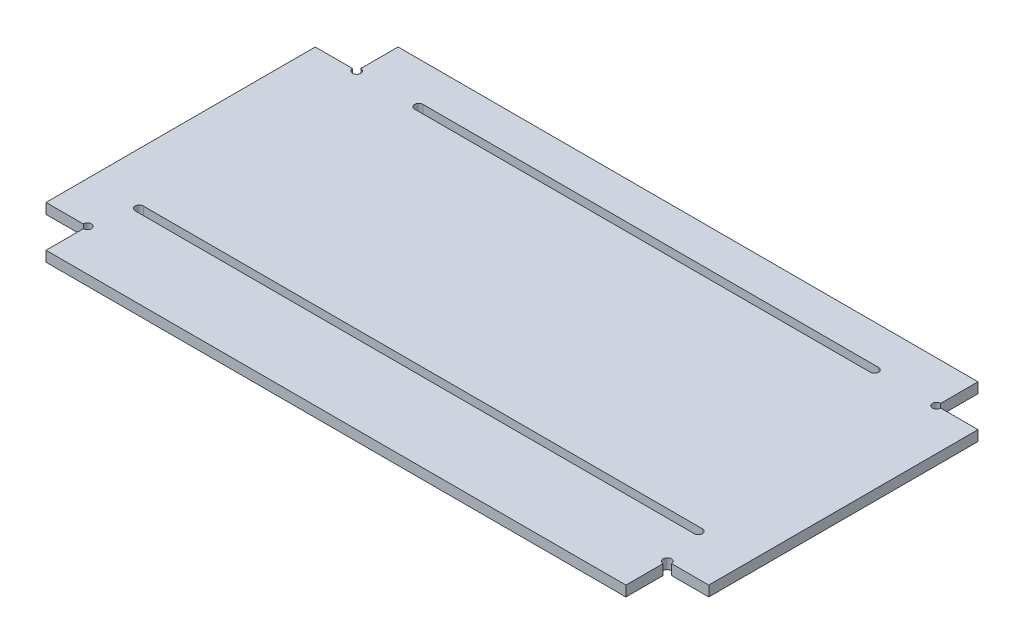
ISO-10303-21;
HEADER;
FILE_DESCRIPTION(('STEP AP214'),'2;1');
FILE_NAME('part.step','',(''),(''),'','','');
FILE_SCHEMA(('AUTOMOTIVE_DESIGN { 1 0 10303 214 1 1 1 1 }'));
ENDSEC;
DATA;
#1=APPLICATION_CONTEXT('core data for automotive mechanical design processes');
#2=APPLICATION_PROTOCOL_DEFINITION('international standard','automotive_design',2000,#1);
#3=PRODUCT_CONTEXT('',#1,'mechanical');
#4=PRODUCT('Part','Part','',(#3));
#5=PRODUCT_RELATED_PRODUCT_CATEGORY('part','',(#4));
#6=PRODUCT_DEFINITION_FORMATION('','',#4);
#7=PRODUCT_DEFINITION_CONTEXT('part definition',#1,'design');
#8=PRODUCT_DEFINITION('design','',#6,#7);
#9=PRODUCT_DEFINITION_SHAPE('','',#8);
#10=(LENGTH_UNIT() NAMED_UNIT(*) SI_UNIT(.MILLI.,.METRE.));
#11=(NAMED_UNIT(*) PLANE_ANGLE_UNIT() SI_UNIT($,.RADIAN.));
#12=(NAMED_UNIT(*) SI_UNIT($,.STERADIAN.) SOLID_ANGLE_UNIT());
#13=UNCERTAINTY_MEASURE_WITH_UNIT(LENGTH_MEASURE(1.E-05),#10,'distance_accuracy_value','');
#14=(GEOMETRIC_REPRESENTATION_CONTEXT(3) GLOBAL_UNCERTAINTY_ASSIGNED_CONTEXT((#13)) GLOBAL_UNIT_ASSIGNED_CONTEXT((#10,
#11,#12)) REPRESENTATION_CONTEXT('',''));
#15=CARTESIAN_POINT('',(0.,0.,0.));
#16=DIRECTION('',(0.,0.,1.));
#17=DIRECTION('',(1.,0.,0.));
#18=AXIS2_PLACEMENT_3D('',#15,#16,#17);
#19=CARTESIAN_POINT('',(160.,5.,-85.));
#20=DIRECTION('',(-1.,0.,0.));
#21=DIRECTION('',(0.,0.,1.));
#22=AXIS2_PLACEMENT_3D('',#19,#20,#21);
#23=PLANE('',#22);
#24=DIRECTION('',(0.,0.,-1.));
#25=VECTOR('',#24,1.);
#26=CARTESIAN_POINT('',(160.,0.,-85.));
#27=LINE('',#26,#25);
#28=CARTESIAN_POINT('',(160.,0.,65.));
#29=VERTEX_POINT('',#28);
#30=CARTESIAN_POINT('',(160.,0.,-65.));
#31=VERTEX_POINT('',#30);
#32=EDGE_CURVE('E277',#29,#31,#27,.T.);
#33=ORIENTED_EDGE('',*,*,#32,.T.);
#34=DIRECTION('',(0.,1.,0.));
#35=VECTOR('',#34,1.);
#36=CARTESIAN_POINT('',(160.,0.,-65.));
#37=LINE('',#36,#35);
#38=CARTESIAN_POINT('',(160.,5.,-65.));
#39=VERTEX_POINT('',#38);
#40=EDGE_CURVE('E229',#31,#39,#37,.T.);
#41=ORIENTED_EDGE('',*,*,#40,.T.);
#42=DIRECTION('',(0.,0.,-1.));
#43=VECTOR('',#42,1.);
#44=CARTESIAN_POINT('',(160.,5.,-85.));
#45=LINE('',#44,#43);
#46=CARTESIAN_POINT('',(160.,5.,65.));
#47=VERTEX_POINT('',#46);
#48=EDGE_CURVE('E219',#47,#39,#45,.T.);
#49=ORIENTED_EDGE('',*,*,#48,.F.);
#50=DIRECTION('',(0.,1.,0.));
#51=VECTOR('',#50,1.);
#52=CARTESIAN_POINT('',(160.,0.,65.));
#53=LINE('',#52,#51);
#54=EDGE_CURVE('E225',#29,#47,#53,.T.);
#55=ORIENTED_EDGE('',*,*,#54,.F.);
#56=EDGE_LOOP('',(#33,#41,#49,#55));
#57=FACE_BOUND('',#56,.T.);
#58=ADVANCED_FACE('F33',(#57),#23,.F.);
#59=CARTESIAN_POINT('',(-160.,5.,-85.));
#60=DIRECTION('',(0.,0.,1.));
#61=DIRECTION('',(1.,0.,0.));
#62=AXIS2_PLACEMENT_3D('',#59,#60,#61);
#63=PLANE('',#62);
#64=DIRECTION('',(-1.,0.,0.));
#65=VECTOR('',#64,1.);
#66=CARTESIAN_POINT('',(-160.,5.,-85.));
#67=LINE('',#66,#65);
#68=CARTESIAN_POINT('',(140.,5.,-85.));
#69=VERTEX_POINT('',#68);
#70=CARTESIAN_POINT('',(-140.,5.,-85.));
#71=VERTEX_POINT('',#70);
#72=EDGE_CURVE('E280',#69,#71,#67,.T.);
#73=ORIENTED_EDGE('',*,*,#72,.F.);
#74=DIRECTION('',(0.,1.,0.));
#75=VECTOR('',#74,1.);
#76=CARTESIAN_POINT('',(140.,0.,-85.));
#77=LINE('',#76,#75);
#78=CARTESIAN_POINT('',(140.,0.,-85.));
#79=VERTEX_POINT('',#78);
#80=EDGE_CURVE('E232',#79,#69,#77,.T.);
#81=ORIENTED_EDGE('',*,*,#80,.F.);
#82=DIRECTION('',(-1.,0.,0.));
#83=VECTOR('',#82,1.);
#84=CARTESIAN_POINT('',(-160.,0.,-85.));
#85=LINE('',#84,#83);
#86=CARTESIAN_POINT('',(-140.,0.,-85.));
#87=VERTEX_POINT('',#86);
#88=EDGE_CURVE('E293',#79,#87,#85,.T.);
#89=ORIENTED_EDGE('',*,*,#88,.T.);
#90=DIRECTION('',(0.,1.,0.));
#91=VECTOR('',#90,1.);
#92=CARTESIAN_POINT('',(-140.,0.,-85.));
#93=LINE('',#92,#91);
#94=EDGE_CURVE('E274',#87,#71,#93,.T.);
#95=ORIENTED_EDGE('',*,*,#94,.T.);
#96=EDGE_LOOP('',(#73,#81,#89,#95));
#97=FACE_BOUND('',#96,.T.);
#98=ADVANCED_FACE('F423',(#97),#63,.F.);
#99=CARTESIAN_POINT('',(-160.,5.,-85.));
#100=DIRECTION('',(1.,0.,0.));
#101=DIRECTION('',(0.,0.,-1.));
#102=AXIS2_PLACEMENT_3D('',#99,#100,#101);
#103=PLANE('',#102);
#104=DIRECTION('',(0.,0.,1.));
#105=VECTOR('',#104,1.);
#106=CARTESIAN_POINT('',(-160.,0.,-85.));
#107=LINE('',#106,#105);
#108=CARTESIAN_POINT('',(-160.,0.,-65.));
#109=VERTEX_POINT('',#108);
#110=CARTESIAN_POINT('',(-160.,0.,65.));
#111=VERTEX_POINT('',#110);
#112=EDGE_CURVE('E296',#109,#111,#107,.T.);
#113=ORIENTED_EDGE('',*,*,#112,.T.);
#114=DIRECTION('',(0.,1.,0.));
#115=VECTOR('',#114,1.);
#116=CARTESIAN_POINT('',(-160.,0.,65.));
#117=LINE('',#116,#115);
#118=CARTESIAN_POINT('',(-160.,5.,65.));
#119=VERTEX_POINT('',#118);
#120=EDGE_CURVE('E255',#111,#119,#117,.T.);
#121=ORIENTED_EDGE('',*,*,#120,.T.);
#122=DIRECTION('',(0.,0.,1.));
#123=VECTOR('',#122,1.);
#124=CARTESIAN_POINT('',(-160.,5.,-85.));
#125=LINE('',#124,#123);
#126=CARTESIAN_POINT('',(-160.,5.,-65.));
#127=VERTEX_POINT('',#126);
#128=EDGE_CURVE('E284',#127,#119,#125,.T.);
#129=ORIENTED_EDGE('',*,*,#128,.F.);
#130=DIRECTION('',(0.,1.,0.));
#131=VECTOR('',#130,1.);
#132=CARTESIAN_POINT('',(-160.,0.,-65.));
#133=LINE('',#132,#131);
#134=EDGE_CURVE('E270',#109,#127,#133,.T.);
#135=ORIENTED_EDGE('',*,*,#134,.F.);
#136=EDGE_LOOP('',(#113,#121,#129,#135));
#137=FACE_BOUND('',#136,.T.);
#138=ADVANCED_FACE('F427',(#137),#103,.F.);
#139=CARTESIAN_POINT('',(-160.,5.,85.));
#140=DIRECTION('',(0.,0.,-1.));
#141=DIRECTION('',(-1.,0.,0.));
#142=AXIS2_PLACEMENT_3D('',#139,#140,#141);
#143=PLANE('',#142);
#144=DIRECTION('',(1.,0.,0.));
#145=VECTOR('',#144,1.);
#146=CARTESIAN_POINT('',(-160.,0.,85.));
#147=LINE('',#146,#145);
#148=CARTESIAN_POINT('',(-140.,0.,85.));
#149=VERTEX_POINT('',#148);
#150=CARTESIAN_POINT('',(140.,0.,85.));
#151=VERTEX_POINT('',#150);
#152=EDGE_CURVE('E281',#149,#151,#147,.T.);
#153=ORIENTED_EDGE('',*,*,#152,.T.);
#154=DIRECTION('',(0.,1.,0.));
#155=VECTOR('',#154,1.);
#156=CARTESIAN_POINT('',(140.,0.,85.));
#157=LINE('',#156,#155);
#158=CARTESIAN_POINT('',(140.,5.,85.));
#159=VERTEX_POINT('',#158);
#160=EDGE_CURVE('E240',#151,#159,#157,.T.);
#161=ORIENTED_EDGE('',*,*,#160,.T.);
#162=DIRECTION('',(1.,0.,0.));
#163=VECTOR('',#162,1.);
#164=CARTESIAN_POINT('',(-160.,5.,85.));
#165=LINE('',#164,#163);
#166=CARTESIAN_POINT('',(-140.,5.,85.));
#167=VERTEX_POINT('',#166);
#168=EDGE_CURVE('E287',#167,#159,#165,.T.);
#169=ORIENTED_EDGE('',*,*,#168,.F.);
#170=DIRECTION('',(0.,1.,0.));
#171=VECTOR('',#170,1.);
#172=CARTESIAN_POINT('',(-140.,0.,85.));
#173=LINE('',#172,#171);
#174=EDGE_CURVE('E243',#149,#167,#173,.T.);
#175=ORIENTED_EDGE('',*,*,#174,.F.);
#176=EDGE_LOOP('',(#153,#161,#169,#175));
#177=FACE_BOUND('',#176,.T.);
#178=ADVANCED_FACE('F432',(#177),#143,.F.);
#179=CARTESIAN_POINT('',(0.,5.,0.));
#180=DIRECTION('',(0.,1.,0.));
#181=DIRECTION('',(0.,0.,1.));
#182=AXIS2_PLACEMENT_3D('',#179,#180,#181);
#183=PLANE('',#182);
#184=CARTESIAN_POINT('',(-140.,5.,65.));
#185=DIRECTION('',(0.,1.,0.));
#186=DIRECTION('',(0.,0.,1.));
#187=AXIS2_PLACEMENT_3D('',#184,#185,#186);
#188=CIRCLE('',#187,2.);
#189=CARTESIAN_POINT('',(-140.,5.,67.));
#190=VERTEX_POINT('',#189);
#191=CARTESIAN_POINT('',(-142.,5.,65.));
#192=VERTEX_POINT('',#191);
#193=EDGE_CURVE('E47',#190,#192,#188,.T.);
#194=ORIENTED_EDGE('',*,*,#193,.F.);
#195=DIRECTION('',(0.,0.,-1.));
#196=VECTOR('',#195,1.);
#197=CARTESIAN_POINT('',(-140.,5.,85.));
#198=LINE('',#197,#196);
#199=EDGE_CURVE('E256',#167,#190,#198,.T.);
#200=ORIENTED_EDGE('',*,*,#199,.F.);
#201=ORIENTED_EDGE('',*,*,#168,.T.);
#202=DIRECTION('',(0.,0.,1.));
#203=VECTOR('',#202,1.);
#204=CARTESIAN_POINT('',(140.,5.,85.));
#205=LINE('',#204,#203);
#206=CARTESIAN_POINT('',(140.,5.,67.));
#207=VERTEX_POINT('',#206);
#208=EDGE_CURVE('E241',#207,#159,#205,.T.);
#209=ORIENTED_EDGE('',*,*,#208,.F.);
#210=CARTESIAN_POINT('',(140.,5.,65.));
#211=DIRECTION('',(0.,1.,0.));
#212=DIRECTION('',(0.,0.,1.));
#213=AXIS2_PLACEMENT_3D('',#210,#211,#212);
#214=CIRCLE('',#213,2.);
#215=CARTESIAN_POINT('',(142.,5.,65.));
#216=VERTEX_POINT('',#215);
#217=EDGE_CURVE('E313',#216,#207,#214,.T.);
#218=ORIENTED_EDGE('',*,*,#217,.F.);
#219=DIRECTION('',(-1.,0.,0.));
#220=VECTOR('',#219,1.);
#221=CARTESIAN_POINT('',(160.,5.,65.));
#222=LINE('',#221,#220);
#223=EDGE_CURVE('E237',#47,#216,#222,.T.);
#224=ORIENTED_EDGE('',*,*,#223,.F.);
#225=ORIENTED_EDGE('',*,*,#48,.T.);
#226=DIRECTION('',(1.,0.,0.));
#227=VECTOR('',#226,1.);
#228=CARTESIAN_POINT('',(160.,5.,-65.));
#229=LINE('',#228,#227);
#230=CARTESIAN_POINT('',(142.,5.,-65.));
#231=VERTEX_POINT('',#230);
#232=EDGE_CURVE('E208',#231,#39,#229,.T.);
#233=ORIENTED_EDGE('',*,*,#232,.F.);
#234=CARTESIAN_POINT('',(140.,5.,-65.));
#235=DIRECTION('',(0.,1.,0.));
#236=DIRECTION('',(0.,0.,1.));
#237=AXIS2_PLACEMENT_3D('',#234,#235,#236);
#238=CIRCLE('',#237,2.);
#239=CARTESIAN_POINT('',(140.,5.,-67.));
#240=VERTEX_POINT('',#239);
#241=EDGE_CURVE('E191',#240,#231,#238,.T.);
#242=ORIENTED_EDGE('',*,*,#241,.F.);
#243=DIRECTION('',(0.,0.,1.));
#244=VECTOR('',#243,1.);
#245=CARTESIAN_POINT('',(140.,5.,-85.));
#246=LINE('',#245,#244);
#247=EDGE_CURVE('E221',#69,#240,#246,.T.);
#248=ORIENTED_EDGE('',*,*,#247,.F.);
#249=ORIENTED_EDGE('',*,*,#72,.T.);
#250=DIRECTION('',(0.,0.,-1.));
#251=VECTOR('',#250,1.);
#252=CARTESIAN_POINT('',(-140.,5.,-85.));
#253=LINE('',#252,#251);
#254=CARTESIAN_POINT('',(-140.,5.,-67.));
#255=VERTEX_POINT('',#254);
#256=EDGE_CURVE('E268',#255,#71,#253,.T.);
#257=ORIENTED_EDGE('',*,*,#256,.F.);
#258=CARTESIAN_POINT('',(-140.,5.,-65.));
#259=DIRECTION('',(0.,1.,0.));
#260=DIRECTION('',(0.,0.,1.));
#261=AXIS2_PLACEMENT_3D('',#258,#259,#260);
#262=CIRCLE('',#261,2.);
#263=CARTESIAN_POINT('',(-142.,5.,-65.));
#264=VERTEX_POINT('',#263);
#265=EDGE_CURVE('E324',#264,#255,#262,.T.);
#266=ORIENTED_EDGE('',*,*,#265,.F.);
#267=DIRECTION('',(1.,0.,0.));
#268=VECTOR('',#267,1.);
#269=CARTESIAN_POINT('',(-160.,5.,-65.));
#270=LINE('',#269,#268);
#271=EDGE_CURVE('E231',#127,#264,#270,.T.);
#272=ORIENTED_EDGE('',*,*,#271,.F.);
#273=ORIENTED_EDGE('',*,*,#128,.T.);
#274=DIRECTION('',(-1.,0.,0.));
#275=VECTOR('',#274,1.);
#276=CARTESIAN_POINT('',(-160.,5.,65.));
#277=LINE('',#276,#275);
#278=EDGE_CURVE('E253',#192,#119,#277,.T.);
#279=ORIENTED_EDGE('',*,*,#278,.F.);
#280=EDGE_LOOP('',(#194,#200,#201,#209,#218,#224,#225,#233,#242,#248,#249,#257,#266,#272,#273,#279));
#281=FACE_BOUND('',#280,.T.);
#282=CARTESIAN_POINT('',(-135.,5.,45.));
#283=DIRECTION('',(0.,1.,0.));
#284=DIRECTION('',(0.,0.,1.));
#285=AXIS2_PLACEMENT_3D('',#282,#283,#284);
#286=CIRCLE('',#285,2.);
#287=CARTESIAN_POINT('',(-135.,5.,43.));
#288=VERTEX_POINT('',#287);
#289=CARTESIAN_POINT('',(-135.,5.,47.));
#290=VERTEX_POINT('',#289);
#291=EDGE_CURVE('E332',#288,#290,#286,.T.);
#292=ORIENTED_EDGE('',*,*,#291,.F.);
#293=DIRECTION('',(-1.,0.,0.));
#294=VECTOR('',#293,1.);
#295=CARTESIAN_POINT('',(-135.,5.,43.));
#296=LINE('',#295,#294);
#297=CARTESIAN_POINT('',(135.,5.,43.));
#298=VERTEX_POINT('',#297);
#299=EDGE_CURVE('E337',#298,#288,#296,.T.);
#300=ORIENTED_EDGE('',*,*,#299,.F.);
#301=CARTESIAN_POINT('',(135.,5.,45.));
#302=DIRECTION('',(0.,1.,0.));
#303=DIRECTION('',(0.,0.,1.));
#304=AXIS2_PLACEMENT_3D('',#301,#302,#303);
#305=CIRCLE('',#304,2.);
#306=CARTESIAN_POINT('',(135.,5.,47.));
#307=VERTEX_POINT('',#306);
#308=EDGE_CURVE('E351',#307,#298,#305,.T.);
#309=ORIENTED_EDGE('',*,*,#308,.F.);
#310=DIRECTION('',(1.,0.,0.));
#311=VECTOR('',#310,1.);
#312=CARTESIAN_POINT('',(-135.,5.,47.));
#313=LINE('',#312,#311);
#314=EDGE_CURVE('E348',#290,#307,#313,.T.);
#315=ORIENTED_EDGE('',*,*,#314,.F.);
#316=EDGE_LOOP('',(#292,#300,#309,#315));
#317=FACE_BOUND('',#316,.T.);
#318=CARTESIAN_POINT('',(-110.,5.,-65.));
#319=DIRECTION('',(0.,1.,0.));
#320=DIRECTION('',(0.,0.,1.));
#321=AXIS2_PLACEMENT_3D('',#318,#319,#320);
#322=CIRCLE('',#321,2.);
#323=CARTESIAN_POINT('',(-110.,5.,-67.));
#324=VERTEX_POINT('',#323);
#325=CARTESIAN_POINT('',(-110.,5.,-63.));
#326=VERTEX_POINT('',#325);
#327=EDGE_CURVE('E358',#324,#326,#322,.T.);
#328=ORIENTED_EDGE('',*,*,#327,.F.);
#329=DIRECTION('',(-1.,0.,0.));
#330=VECTOR('',#329,1.);
#331=CARTESIAN_POINT('',(-110.,5.,-67.));
#332=LINE('',#331,#330);
#333=CARTESIAN_POINT('',(110.,5.,-67.));
#334=VERTEX_POINT('',#333);
#335=EDGE_CURVE('E369',#334,#324,#332,.T.);
#336=ORIENTED_EDGE('',*,*,#335,.F.);
#337=CARTESIAN_POINT('',(110.,5.,-65.));
#338=DIRECTION('',(0.,1.,0.));
#339=DIRECTION('',(0.,0.,1.));
#340=AXIS2_PLACEMENT_3D('',#337,#338,#339);
#341=CIRCLE('',#340,2.);
#342=CARTESIAN_POINT('',(110.,5.,-63.));
#343=VERTEX_POINT('',#342);
#344=EDGE_CURVE('E383',#343,#334,#341,.T.);
#345=ORIENTED_EDGE('',*,*,#344,.F.);
#346=DIRECTION('',(1.,0.,0.));
#347=VECTOR('',#346,1.);
#348=CARTESIAN_POINT('',(-110.,5.,-63.));
#349=LINE('',#348,#347);
#350=EDGE_CURVE('E380',#326,#343,#349,.T.);
#351=ORIENTED_EDGE('',*,*,#350,.F.);
#352=EDGE_LOOP('',(#328,#336,#345,#351));
#353=FACE_BOUND('',#352,.T.);
#354=ADVANCED_FACE('F215',(#281,#317,#353),#183,.T.);
#355=CARTESIAN_POINT('',(0.,0.,0.));
#356=DIRECTION('',(0.,1.,0.));
#357=DIRECTION('',(0.,0.,1.));
#358=AXIS2_PLACEMENT_3D('',#355,#356,#357);
#359=PLANE('',#358);
#360=DIRECTION('',(-1.,0.,0.));
#361=VECTOR('',#360,1.);
#362=CARTESIAN_POINT('',(-135.,0.,43.));
#363=LINE('',#362,#361);
#364=CARTESIAN_POINT('',(135.,0.,43.));
#365=VERTEX_POINT('',#364);
#366=CARTESIAN_POINT('',(-135.,0.,43.));
#367=VERTEX_POINT('',#366);
#368=EDGE_CURVE('E343',#365,#367,#363,.T.);
#369=ORIENTED_EDGE('',*,*,#368,.T.);
#370=CARTESIAN_POINT('',(-135.,0.,45.));
#371=DIRECTION('',(0.,1.,0.));
#372=DIRECTION('',(0.,0.,1.));
#373=AXIS2_PLACEMENT_3D('',#370,#371,#372);
#374=CIRCLE('',#373,2.);
#375=CARTESIAN_POINT('',(-135.,0.,47.));
#376=VERTEX_POINT('',#375);
#377=EDGE_CURVE('E333',#367,#376,#374,.T.);
#378=ORIENTED_EDGE('',*,*,#377,.T.);
#379=DIRECTION('',(1.,0.,0.));
#380=VECTOR('',#379,1.);
#381=CARTESIAN_POINT('',(-135.,0.,47.));
#382=LINE('',#381,#380);
#383=CARTESIAN_POINT('',(135.,0.,47.));
#384=VERTEX_POINT('',#383);
#385=EDGE_CURVE('E336',#376,#384,#382,.T.);
#386=ORIENTED_EDGE('',*,*,#385,.T.);
#387=CARTESIAN_POINT('',(135.,0.,45.));
#388=DIRECTION('',(0.,1.,0.));
#389=DIRECTION('',(0.,0.,1.));
#390=AXIS2_PLACEMENT_3D('',#387,#388,#389);
#391=CIRCLE('',#390,2.);
#392=EDGE_CURVE('E340',#384,#365,#391,.T.);
#393=ORIENTED_EDGE('',*,*,#392,.T.);
#394=EDGE_LOOP('',(#369,#378,#386,#393));
#395=FACE_BOUND('',#394,.T.);
#396=DIRECTION('',(-1.,0.,0.));
#397=VECTOR('',#396,1.);
#398=CARTESIAN_POINT('',(-110.,0.,-67.));
#399=LINE('',#398,#397);
#400=CARTESIAN_POINT('',(110.,0.,-67.));
#401=VERTEX_POINT('',#400);
#402=CARTESIAN_POINT('',(-110.,0.,-67.));
#403=VERTEX_POINT('',#402);
#404=EDGE_CURVE('E375',#401,#403,#399,.T.);
#405=ORIENTED_EDGE('',*,*,#404,.T.);
#406=CARTESIAN_POINT('',(-110.,0.,-65.));
#407=DIRECTION('',(0.,1.,0.));
#408=DIRECTION('',(0.,0.,1.));
#409=AXIS2_PLACEMENT_3D('',#406,#407,#408);
#410=CIRCLE('',#409,2.);
#411=CARTESIAN_POINT('',(-110.,0.,-63.));
#412=VERTEX_POINT('',#411);
#413=EDGE_CURVE('E365',#403,#412,#410,.T.);
#414=ORIENTED_EDGE('',*,*,#413,.T.);
#415=DIRECTION('',(1.,0.,0.));
#416=VECTOR('',#415,1.);
#417=CARTESIAN_POINT('',(-110.,0.,-63.));
#418=LINE('',#417,#416);
#419=CARTESIAN_POINT('',(110.,0.,-63.));
#420=VERTEX_POINT('',#419);
#421=EDGE_CURVE('E368',#412,#420,#418,.T.);
#422=ORIENTED_EDGE('',*,*,#421,.T.);
#423=CARTESIAN_POINT('',(110.,0.,-65.));
#424=DIRECTION('',(0.,1.,0.));
#425=DIRECTION('',(0.,0.,1.));
#426=AXIS2_PLACEMENT_3D('',#423,#424,#425);
#427=CIRCLE('',#426,2.);
#428=EDGE_CURVE('E372',#420,#401,#427,.T.);
#429=ORIENTED_EDGE('',*,*,#428,.T.);
#430=EDGE_LOOP('',(#405,#414,#422,#429));
#431=FACE_BOUND('',#430,.T.);
#432=DIRECTION('',(0.,0.,-1.));
#433=VECTOR('',#432,1.);
#434=CARTESIAN_POINT('',(-140.,0.,85.));
#435=LINE('',#434,#433);
#436=CARTESIAN_POINT('',(-140.,0.,67.));
#437=VERTEX_POINT('',#436);
#438=EDGE_CURVE('E249',#149,#437,#435,.T.);
#439=ORIENTED_EDGE('',*,*,#438,.T.);
#440=CARTESIAN_POINT('',(-140.,0.,65.));
#441=DIRECTION('',(0.,1.,0.));
#442=DIRECTION('',(0.,0.,1.));
#443=AXIS2_PLACEMENT_3D('',#440,#441,#442);
#444=CIRCLE('',#443,2.);
#445=CARTESIAN_POINT('',(-142.,0.,65.));
#446=VERTEX_POINT('',#445);
#447=EDGE_CURVE('E212',#437,#446,#444,.T.);
#448=ORIENTED_EDGE('',*,*,#447,.T.);
#449=DIRECTION('',(-1.,0.,0.));
#450=VECTOR('',#449,1.);
#451=CARTESIAN_POINT('',(-160.,0.,65.));
#452=LINE('',#451,#450);
#453=EDGE_CURVE('E252',#446,#111,#452,.T.);
#454=ORIENTED_EDGE('',*,*,#453,.T.);
#455=ORIENTED_EDGE('',*,*,#112,.F.);
#456=DIRECTION('',(1.,0.,0.));
#457=VECTOR('',#456,1.);
#458=CARTESIAN_POINT('',(-160.,0.,-65.));
#459=LINE('',#458,#457);
#460=CARTESIAN_POINT('',(-142.,0.,-65.));
#461=VERTEX_POINT('',#460);
#462=EDGE_CURVE('E264',#109,#461,#459,.T.);
#463=ORIENTED_EDGE('',*,*,#462,.T.);
#464=CARTESIAN_POINT('',(-140.,0.,-65.));
#465=DIRECTION('',(0.,1.,0.));
#466=DIRECTION('',(0.,0.,1.));
#467=AXIS2_PLACEMENT_3D('',#464,#465,#466);
#468=CIRCLE('',#467,2.);
#469=CARTESIAN_POINT('',(-140.,0.,-67.));
#470=VERTEX_POINT('',#469);
#471=EDGE_CURVE('E325',#461,#470,#468,.T.);
#472=ORIENTED_EDGE('',*,*,#471,.T.);
#473=DIRECTION('',(0.,0.,-1.));
#474=VECTOR('',#473,1.);
#475=CARTESIAN_POINT('',(-140.,0.,-85.));
#476=LINE('',#475,#474);
#477=EDGE_CURVE('E267',#470,#87,#476,.T.);
#478=ORIENTED_EDGE('',*,*,#477,.T.);
#479=ORIENTED_EDGE('',*,*,#88,.F.);
#480=DIRECTION('',(0.,0.,1.));
#481=VECTOR('',#480,1.);
#482=CARTESIAN_POINT('',(140.,0.,-85.));
#483=LINE('',#482,#481);
#484=CARTESIAN_POINT('',(140.,0.,-67.));
#485=VERTEX_POINT('',#484);
#486=EDGE_CURVE('E220',#79,#485,#483,.T.);
#487=ORIENTED_EDGE('',*,*,#486,.T.);
#488=CARTESIAN_POINT('',(140.,0.,-65.));
#489=DIRECTION('',(0.,1.,0.));
#490=DIRECTION('',(0.,0.,1.));
#491=AXIS2_PLACEMENT_3D('',#488,#489,#490);
#492=CIRCLE('',#491,2.);
#493=CARTESIAN_POINT('',(142.,0.,-65.));
#494=VERTEX_POINT('',#493);
#495=EDGE_CURVE('E202',#485,#494,#492,.T.);
#496=ORIENTED_EDGE('',*,*,#495,.T.);
#497=DIRECTION('',(1.,0.,0.));
#498=VECTOR('',#497,1.);
#499=CARTESIAN_POINT('',(160.,0.,-65.));
#500=LINE('',#499,#498);
#501=EDGE_CURVE('E210',#494,#31,#500,.T.);
#502=ORIENTED_EDGE('',*,*,#501,.T.);
#503=ORIENTED_EDGE('',*,*,#32,.F.);
#504=DIRECTION('',(-1.,0.,0.));
#505=VECTOR('',#504,1.);
#506=CARTESIAN_POINT('',(160.,0.,65.));
#507=LINE('',#506,#505);
#508=CARTESIAN_POINT('',(142.,0.,65.));
#509=VERTEX_POINT('',#508);
#510=EDGE_CURVE('E236',#29,#509,#507,.T.);
#511=ORIENTED_EDGE('',*,*,#510,.T.);
#512=CARTESIAN_POINT('',(140.,0.,65.));
#513=DIRECTION('',(0.,1.,0.));
#514=DIRECTION('',(0.,0.,1.));
#515=AXIS2_PLACEMENT_3D('',#512,#513,#514);
#516=CIRCLE('',#515,2.);
#517=CARTESIAN_POINT('',(140.,0.,67.));
#518=VERTEX_POINT('',#517);
#519=EDGE_CURVE('E54',#509,#518,#516,.T.);
#520=ORIENTED_EDGE('',*,*,#519,.T.);
#521=DIRECTION('',(0.,0.,1.));
#522=VECTOR('',#521,1.);
#523=CARTESIAN_POINT('',(140.,0.,85.));
#524=LINE('',#523,#522);
#525=EDGE_CURVE('E234',#518,#151,#524,.T.);
#526=ORIENTED_EDGE('',*,*,#525,.T.);
#527=ORIENTED_EDGE('',*,*,#152,.F.);
#528=EDGE_LOOP('',(#439,#448,#454,#455,#463,#472,#478,#479,#487,#496,#502,#503,#511,#520,#526,#527));
#529=FACE_BOUND('',#528,.T.);
#530=ADVANCED_FACE('F309',(#395,#431,#529),#359,.F.);
#531=CARTESIAN_POINT('',(-140.,0.,-85.));
#532=DIRECTION('',(1.,0.,0.));
#533=DIRECTION('',(0.,0.,-1.));
#534=AXIS2_PLACEMENT_3D('',#531,#532,#533);
#535=PLANE('',#534);
#536=ORIENTED_EDGE('',*,*,#477,.F.);
#537=DIRECTION('',(0.,1.,0.));
#538=VECTOR('',#537,1.);
#539=CARTESIAN_POINT('',(-140.,0.,-67.));
#540=LINE('',#539,#538);
#541=EDGE_CURVE('E328',#470,#255,#540,.T.);
#542=ORIENTED_EDGE('',*,*,#541,.T.);
#543=ORIENTED_EDGE('',*,*,#256,.T.);
#544=ORIENTED_EDGE('',*,*,#94,.F.);
#545=EDGE_LOOP('',(#536,#542,#543,#544));
#546=FACE_BOUND('',#545,.T.);
#547=ADVANCED_FACE('F442',(#546),#535,.F.);
#548=CARTESIAN_POINT('',(-160.,0.,-65.));
#549=DIRECTION('',(0.,0.,1.));
#550=DIRECTION('',(1.,0.,0.));
#551=AXIS2_PLACEMENT_3D('',#548,#549,#550);
#552=PLANE('',#551);
#553=ORIENTED_EDGE('',*,*,#271,.T.);
#554=DIRECTION('',(0.,1.,0.));
#555=VECTOR('',#554,1.);
#556=CARTESIAN_POINT('',(-142.,0.,-65.));
#557=LINE('',#556,#555);
#558=EDGE_CURVE('E290',#264,#461,#557,.F.);
#559=ORIENTED_EDGE('',*,*,#558,.T.);
#560=ORIENTED_EDGE('',*,*,#462,.F.);
#561=ORIENTED_EDGE('',*,*,#134,.T.);
#562=EDGE_LOOP('',(#553,#559,#560,#561));
#563=FACE_BOUND('',#562,.T.);
#564=ADVANCED_FACE('F446',(#563),#552,.F.);
#565=CARTESIAN_POINT('',(-140.,0.,85.));
#566=DIRECTION('',(1.,0.,0.));
#567=DIRECTION('',(0.,0.,-1.));
#568=AXIS2_PLACEMENT_3D('',#565,#566,#567);
#569=PLANE('',#568);
#570=ORIENTED_EDGE('',*,*,#199,.T.);
#571=DIRECTION('',(0.,1.,0.));
#572=VECTOR('',#571,1.);
#573=CARTESIAN_POINT('',(-140.,0.,67.));
#574=LINE('',#573,#572);
#575=EDGE_CURVE('E321',#190,#437,#574,.F.);
#576=ORIENTED_EDGE('',*,*,#575,.T.);
#577=ORIENTED_EDGE('',*,*,#438,.F.);
#578=ORIENTED_EDGE('',*,*,#174,.T.);
#579=EDGE_LOOP('',(#570,#576,#577,#578));
#580=FACE_BOUND('',#579,.T.);
#581=ADVANCED_FACE('F449',(#580),#569,.F.);
#582=CARTESIAN_POINT('',(-160.,0.,65.));
#583=DIRECTION('',(0.,0.,-1.));
#584=DIRECTION('',(-1.,0.,0.));
#585=AXIS2_PLACEMENT_3D('',#582,#583,#584);
#586=PLANE('',#585);
#587=ORIENTED_EDGE('',*,*,#453,.F.);
#588=DIRECTION('',(0.,1.,0.));
#589=VECTOR('',#588,1.);
#590=CARTESIAN_POINT('',(-142.,0.,65.));
#591=LINE('',#590,#589);
#592=EDGE_CURVE('E11',#446,#192,#591,.T.);
#593=ORIENTED_EDGE('',*,*,#592,.T.);
#594=ORIENTED_EDGE('',*,*,#278,.T.);
#595=ORIENTED_EDGE('',*,*,#120,.F.);
#596=EDGE_LOOP('',(#587,#593,#594,#595));
#597=FACE_BOUND('',#596,.T.);
#598=ADVANCED_FACE('F456',(#597),#586,.F.);
#599=CARTESIAN_POINT('',(140.,0.,85.));
#600=DIRECTION('',(-1.,0.,0.));
#601=DIRECTION('',(0.,0.,1.));
#602=AXIS2_PLACEMENT_3D('',#599,#600,#601);
#603=PLANE('',#602);
#604=ORIENTED_EDGE('',*,*,#525,.F.);
#605=DIRECTION('',(0.,1.,0.));
#606=VECTOR('',#605,1.);
#607=CARTESIAN_POINT('',(140.,0.,67.));
#608=LINE('',#607,#606);
#609=EDGE_CURVE('E211',#518,#207,#608,.T.);
#610=ORIENTED_EDGE('',*,*,#609,.T.);
#611=ORIENTED_EDGE('',*,*,#208,.T.);
#612=ORIENTED_EDGE('',*,*,#160,.F.);
#613=EDGE_LOOP('',(#604,#610,#611,#612));
#614=FACE_BOUND('',#613,.T.);
#615=ADVANCED_FACE('F460',(#614),#603,.F.);
#616=CARTESIAN_POINT('',(160.,0.,65.));
#617=DIRECTION('',(0.,0.,-1.));
#618=DIRECTION('',(-1.,0.,0.));
#619=AXIS2_PLACEMENT_3D('',#616,#617,#618);
#620=PLANE('',#619);
#621=ORIENTED_EDGE('',*,*,#223,.T.);
#622=DIRECTION('',(0.,1.,0.));
#623=VECTOR('',#622,1.);
#624=CARTESIAN_POINT('',(142.,0.,65.));
#625=LINE('',#624,#623);
#626=EDGE_CURVE('E40',#216,#509,#625,.F.);
#627=ORIENTED_EDGE('',*,*,#626,.T.);
#628=ORIENTED_EDGE('',*,*,#510,.F.);
#629=ORIENTED_EDGE('',*,*,#54,.T.);
#630=EDGE_LOOP('',(#621,#627,#628,#629));
#631=FACE_BOUND('',#630,.T.);
#632=ADVANCED_FACE('F304',(#631),#620,.F.);
#633=CARTESIAN_POINT('',(160.,0.,-65.));
#634=DIRECTION('',(0.,0.,1.));
#635=DIRECTION('',(1.,0.,0.));
#636=AXIS2_PLACEMENT_3D('',#633,#634,#635);
#637=PLANE('',#636);
#638=ORIENTED_EDGE('',*,*,#501,.F.);
#639=DIRECTION('',(0.,1.,0.));
#640=VECTOR('',#639,1.);
#641=CARTESIAN_POINT('',(142.,0.,-65.));
#642=LINE('',#641,#640);
#643=EDGE_CURVE('E194',#494,#231,#642,.T.);
#644=ORIENTED_EDGE('',*,*,#643,.T.);
#645=ORIENTED_EDGE('',*,*,#232,.T.);
#646=ORIENTED_EDGE('',*,*,#40,.F.);
#647=EDGE_LOOP('',(#638,#644,#645,#646));
#648=FACE_BOUND('',#647,.T.);
#649=ADVANCED_FACE('F206',(#648),#637,.F.);
#650=CARTESIAN_POINT('',(140.,0.,-85.));
#651=DIRECTION('',(-1.,0.,0.));
#652=DIRECTION('',(0.,0.,1.));
#653=AXIS2_PLACEMENT_3D('',#650,#651,#652);
#654=PLANE('',#653);
#655=ORIENTED_EDGE('',*,*,#247,.T.);
#656=DIRECTION('',(0.,1.,0.));
#657=VECTOR('',#656,1.);
#658=CARTESIAN_POINT('',(140.,0.,-67.));
#659=LINE('',#658,#657);
#660=EDGE_CURVE('E197',#240,#485,#659,.F.);
#661=ORIENTED_EDGE('',*,*,#660,.T.);
#662=ORIENTED_EDGE('',*,*,#486,.F.);
#663=ORIENTED_EDGE('',*,*,#80,.T.);
#664=EDGE_LOOP('',(#655,#661,#662,#663));
#665=FACE_BOUND('',#664,.T.);
#666=ADVANCED_FACE('F419',(#665),#654,.F.);
#667=CARTESIAN_POINT('',(-110.,0.,-65.));
#668=DIRECTION('',(0.,1.,0.));
#669=DIRECTION('',(0.,0.,1.));
#670=AXIS2_PLACEMENT_3D('',#667,#668,#669);
#671=CYLINDRICAL_SURFACE('',#670,2.);
#672=ORIENTED_EDGE('',*,*,#327,.T.);
#673=DIRECTION('',(0.,1.,0.));
#674=VECTOR('',#673,1.);
#675=CARTESIAN_POINT('',(-110.,0.,-63.));
#676=LINE('',#675,#674);
#677=EDGE_CURVE('E378',#412,#326,#676,.T.);
#678=ORIENTED_EDGE('',*,*,#677,.F.);
#679=ORIENTED_EDGE('',*,*,#413,.F.);
#680=DIRECTION('',(0.,1.,0.));
#681=VECTOR('',#680,1.);
#682=CARTESIAN_POINT('',(-110.,0.,-67.));
#683=LINE('',#682,#681);
#684=EDGE_CURVE('E259',#403,#324,#683,.T.);
#685=ORIENTED_EDGE('',*,*,#684,.T.);
#686=EDGE_LOOP('',(#672,#678,#679,#685));
#687=FACE_BOUND('',#686,.T.);
#688=ADVANCED_FACE('F409',(#687),#671,.F.);
#689=CARTESIAN_POINT('',(-110.,0.,-67.));
#690=DIRECTION('',(0.,0.,-1.));
#691=DIRECTION('',(-1.,0.,0.));
#692=AXIS2_PLACEMENT_3D('',#689,#690,#691);
#693=PLANE('',#692);
#694=ORIENTED_EDGE('',*,*,#335,.T.);
#695=ORIENTED_EDGE('',*,*,#684,.F.);
#696=ORIENTED_EDGE('',*,*,#404,.F.);
#697=DIRECTION('',(0.,1.,0.));
#698=VECTOR('',#697,1.);
#699=CARTESIAN_POINT('',(110.,0.,-67.));
#700=LINE('',#699,#698);
#701=EDGE_CURVE('E389',#401,#334,#700,.T.);
#702=ORIENTED_EDGE('',*,*,#701,.T.);
#703=EDGE_LOOP('',(#694,#695,#696,#702));
#704=FACE_BOUND('',#703,.T.);
#705=ADVANCED_FACE('F411',(#704),#693,.F.);
#706=CARTESIAN_POINT('',(110.,0.,-65.));
#707=DIRECTION('',(0.,1.,0.));
#708=DIRECTION('',(0.,0.,1.));
#709=AXIS2_PLACEMENT_3D('',#706,#707,#708);
#710=CYLINDRICAL_SURFACE('',#709,2.);
#711=ORIENTED_EDGE('',*,*,#344,.T.);
#712=ORIENTED_EDGE('',*,*,#701,.F.);
#713=ORIENTED_EDGE('',*,*,#428,.F.);
#714=DIRECTION('',(0.,1.,0.));
#715=VECTOR('',#714,1.);
#716=CARTESIAN_POINT('',(110.,0.,-63.));
#717=LINE('',#716,#715);
#718=EDGE_CURVE('E391',#420,#343,#717,.T.);
#719=ORIENTED_EDGE('',*,*,#718,.T.);
#720=EDGE_LOOP('',(#711,#712,#713,#719));
#721=FACE_BOUND('',#720,.T.);
#722=ADVANCED_FACE('F406',(#721),#710,.F.);
#723=CARTESIAN_POINT('',(-110.,0.,-63.));
#724=DIRECTION('',(0.,0.,1.));
#725=DIRECTION('',(1.,0.,0.));
#726=AXIS2_PLACEMENT_3D('',#723,#724,#725);
#727=PLANE('',#726);
#728=ORIENTED_EDGE('',*,*,#350,.T.);
#729=ORIENTED_EDGE('',*,*,#718,.F.);
#730=ORIENTED_EDGE('',*,*,#421,.F.);
#731=ORIENTED_EDGE('',*,*,#677,.T.);
#732=EDGE_LOOP('',(#728,#729,#730,#731));
#733=FACE_BOUND('',#732,.T.);
#734=ADVANCED_FACE('F397',(#733),#727,.F.);
#735=CARTESIAN_POINT('',(-135.,0.,45.));
#736=DIRECTION('',(0.,1.,0.));
#737=DIRECTION('',(0.,0.,1.));
#738=AXIS2_PLACEMENT_3D('',#735,#736,#737);
#739=CYLINDRICAL_SURFACE('',#738,2.);
#740=ORIENTED_EDGE('',*,*,#291,.T.);
#741=DIRECTION('',(0.,1.,0.));
#742=VECTOR('',#741,1.);
#743=CARTESIAN_POINT('',(-135.,0.,47.));
#744=LINE('',#743,#742);
#745=EDGE_CURVE('E346',#376,#290,#744,.T.);
#746=ORIENTED_EDGE('',*,*,#745,.F.);
#747=ORIENTED_EDGE('',*,*,#377,.F.);
#748=DIRECTION('',(0.,1.,0.));
#749=VECTOR('',#748,1.);
#750=CARTESIAN_POINT('',(-135.,0.,43.));
#751=LINE('',#750,#749);
#752=EDGE_CURVE('E356',#367,#288,#751,.T.);
#753=ORIENTED_EDGE('',*,*,#752,.T.);
#754=EDGE_LOOP('',(#740,#746,#747,#753));
#755=FACE_BOUND('',#754,.T.);
#756=ADVANCED_FACE('F473',(#755),#739,.F.);
#757=CARTESIAN_POINT('',(-135.,0.,43.));
#758=DIRECTION('',(0.,0.,-1.));
#759=DIRECTION('',(-1.,0.,0.));
#760=AXIS2_PLACEMENT_3D('',#757,#758,#759);
#761=PLANE('',#760);
#762=ORIENTED_EDGE('',*,*,#299,.T.);
#763=ORIENTED_EDGE('',*,*,#752,.F.);
#764=ORIENTED_EDGE('',*,*,#368,.F.);
#765=DIRECTION('',(0.,1.,0.));
#766=VECTOR('',#765,1.);
#767=CARTESIAN_POINT('',(135.,0.,43.));
#768=LINE('',#767,#766);
#769=EDGE_CURVE('E359',#365,#298,#768,.T.);
#770=ORIENTED_EDGE('',*,*,#769,.T.);
#771=EDGE_LOOP('',(#762,#763,#764,#770));
#772=FACE_BOUND('',#771,.T.);
#773=ADVANCED_FACE('F477',(#772),#761,.F.);
#774=CARTESIAN_POINT('',(135.,0.,45.));
#775=DIRECTION('',(0.,1.,0.));
#776=DIRECTION('',(0.,0.,1.));
#777=AXIS2_PLACEMENT_3D('',#774,#775,#776);
#778=CYLINDRICAL_SURFACE('',#777,2.);
#779=ORIENTED_EDGE('',*,*,#308,.T.);
#780=ORIENTED_EDGE('',*,*,#769,.F.);
#781=ORIENTED_EDGE('',*,*,#392,.F.);
#782=DIRECTION('',(0.,1.,0.));
#783=VECTOR('',#782,1.);
#784=CARTESIAN_POINT('',(135.,0.,47.));
#785=LINE('',#784,#783);
#786=EDGE_CURVE('E361',#384,#307,#785,.T.);
#787=ORIENTED_EDGE('',*,*,#786,.T.);
#788=EDGE_LOOP('',(#779,#780,#781,#787));
#789=FACE_BOUND('',#788,.T.);
#790=ADVANCED_FACE('F482',(#789),#778,.F.);
#791=CARTESIAN_POINT('',(-135.,0.,47.));
#792=DIRECTION('',(0.,0.,1.));
#793=DIRECTION('',(1.,0.,0.));
#794=AXIS2_PLACEMENT_3D('',#791,#792,#793);
#795=PLANE('',#794);
#796=ORIENTED_EDGE('',*,*,#314,.T.);
#797=ORIENTED_EDGE('',*,*,#786,.F.);
#798=ORIENTED_EDGE('',*,*,#385,.F.);
#799=ORIENTED_EDGE('',*,*,#745,.T.);
#800=EDGE_LOOP('',(#796,#797,#798,#799));
#801=FACE_BOUND('',#800,.T.);
#802=ADVANCED_FACE('F486',(#801),#795,.F.);
#803=CARTESIAN_POINT('',(-140.,0.,-65.));
#804=DIRECTION('',(0.,1.,0.));
#805=DIRECTION('',(0.,0.,1.));
#806=AXIS2_PLACEMENT_3D('',#803,#804,#805);
#807=CYLINDRICAL_SURFACE('',#806,2.);
#808=ORIENTED_EDGE('',*,*,#471,.F.);
#809=ORIENTED_EDGE('',*,*,#558,.F.);
#810=ORIENTED_EDGE('',*,*,#265,.T.);
#811=ORIENTED_EDGE('',*,*,#541,.F.);
#812=EDGE_LOOP('',(#808,#809,#810,#811));
#813=FACE_BOUND('',#812,.T.);
#814=ADVANCED_FACE('F489',(#813),#807,.F.);
#815=CARTESIAN_POINT('',(140.,0.,-65.));
#816=DIRECTION('',(0.,1.,0.));
#817=DIRECTION('',(0.,0.,1.));
#818=AXIS2_PLACEMENT_3D('',#815,#816,#817);
#819=CYLINDRICAL_SURFACE('',#818,2.);
#820=ORIENTED_EDGE('',*,*,#495,.F.);
#821=ORIENTED_EDGE('',*,*,#660,.F.);
#822=ORIENTED_EDGE('',*,*,#241,.T.);
#823=ORIENTED_EDGE('',*,*,#643,.F.);
#824=EDGE_LOOP('',(#820,#821,#822,#823));
#825=FACE_BOUND('',#824,.T.);
#826=ADVANCED_FACE('F193',(#825),#819,.F.);
#827=CARTESIAN_POINT('',(140.,0.,65.));
#828=DIRECTION('',(0.,1.,0.));
#829=DIRECTION('',(0.,0.,1.));
#830=AXIS2_PLACEMENT_3D('',#827,#828,#829);
#831=CYLINDRICAL_SURFACE('',#830,2.);
#832=ORIENTED_EDGE('',*,*,#519,.F.);
#833=ORIENTED_EDGE('',*,*,#626,.F.);
#834=ORIENTED_EDGE('',*,*,#217,.T.);
#835=ORIENTED_EDGE('',*,*,#609,.F.);
#836=EDGE_LOOP('',(#832,#833,#834,#835));
#837=FACE_BOUND('',#836,.T.);
#838=ADVANCED_FACE('F499',(#837),#831,.F.);
#839=CARTESIAN_POINT('',(-140.,0.,65.));
#840=DIRECTION('',(0.,1.,0.));
#841=DIRECTION('',(0.,0.,1.));
#842=AXIS2_PLACEMENT_3D('',#839,#840,#841);
#843=CYLINDRICAL_SURFACE('',#842,2.);
#844=ORIENTED_EDGE('',*,*,#193,.T.);
#845=ORIENTED_EDGE('',*,*,#592,.F.);
#846=ORIENTED_EDGE('',*,*,#447,.F.);
#847=ORIENTED_EDGE('',*,*,#575,.F.);
#848=EDGE_LOOP('',(#844,#845,#846,#847));
#849=FACE_BOUND('',#848,.T.);
#850=ADVANCED_FACE('F502',(#849),#843,.F.);
#851=CLOSED_SHELL('',(#58,#98,#138,#178,#354,#530,#547,#564,#581,#598,#615,#632,#649,#666,#688,
#705,#722,#734,#756,#773,#790,#802,#814,#826,#838,#850));
#852=MANIFOLD_SOLID_BREP('B2',#851);
#853=ADVANCED_BREP_SHAPE_REPRESENTATION('',(#18,#852),#14);
#854=SHAPE_DEFINITION_REPRESENTATION(#9,#853);
ENDSEC;
END-ISO-10303-21;
